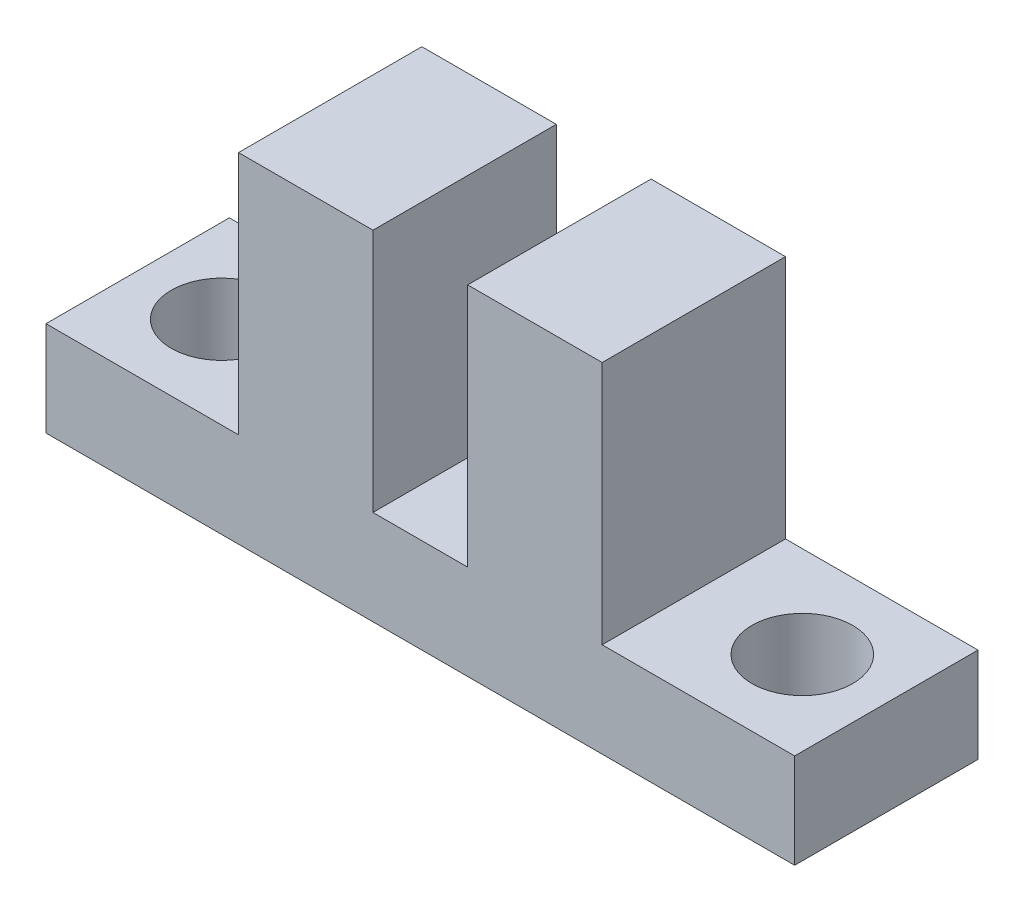
ISO-10303-21;
HEADER;
FILE_DESCRIPTION(('STEP AP214'),'2;1');
FILE_NAME('part.step','',(''),(''),'','','');
FILE_SCHEMA(('AUTOMOTIVE_DESIGN { 1 0 10303 214 1 1 1 1 }'));
ENDSEC;
DATA;
#1=APPLICATION_CONTEXT('core data for automotive mechanical design processes');
#2=APPLICATION_PROTOCOL_DEFINITION('international standard','automotive_design',2000,#1);
#3=PRODUCT_CONTEXT('',#1,'mechanical');
#4=PRODUCT('Part','Part','',(#3));
#5=PRODUCT_RELATED_PRODUCT_CATEGORY('part','',(#4));
#6=PRODUCT_DEFINITION_FORMATION('','',#4);
#7=PRODUCT_DEFINITION_CONTEXT('part definition',#1,'design');
#8=PRODUCT_DEFINITION('design','',#6,#7);
#9=PRODUCT_DEFINITION_SHAPE('','',#8);
#10=(LENGTH_UNIT() NAMED_UNIT(*) SI_UNIT(.MILLI.,.METRE.));
#11=(NAMED_UNIT(*) PLANE_ANGLE_UNIT() SI_UNIT($,.RADIAN.));
#12=(NAMED_UNIT(*) SI_UNIT($,.STERADIAN.) SOLID_ANGLE_UNIT());
#13=UNCERTAINTY_MEASURE_WITH_UNIT(LENGTH_MEASURE(1.E-05),#10,'distance_accuracy_value','');
#14=(GEOMETRIC_REPRESENTATION_CONTEXT(3) GLOBAL_UNCERTAINTY_ASSIGNED_CONTEXT((#13)) GLOBAL_UNIT_ASSIGNED_CONTEXT((#10,
#11,#12)) REPRESENTATION_CONTEXT('',''));
#15=CARTESIAN_POINT('',(0.,0.,0.));
#16=DIRECTION('',(0.,0.,1.));
#17=DIRECTION('',(1.,0.,0.));
#18=AXIS2_PLACEMENT_3D('',#15,#16,#17);
#19=CARTESIAN_POINT('',(0.,3.1,0.));
#20=DIRECTION('',(0.,-1.,0.));
#21=DIRECTION('',(0.,0.,-1.));
#22=AXIS2_PLACEMENT_3D('',#19,#20,#21);
#23=PLANE('',#22);
#24=DIRECTION('',(0.,0.,1.));
#25=VECTOR('',#24,1.);
#26=CARTESIAN_POINT('',(13.8,3.1,-6.));
#27=LINE('',#26,#25);
#28=CARTESIAN_POINT('',(13.8,3.1,-6.));
#29=VERTEX_POINT('',#28);
#30=CARTESIAN_POINT('',(13.8,3.1,0.));
#31=VERTEX_POINT('',#30);
#32=EDGE_CURVE('E145',#29,#31,#27,.T.);
#33=ORIENTED_EDGE('',*,*,#32,.F.);
#34=DIRECTION('',(-1.,0.,0.));
#35=VECTOR('',#34,1.);
#36=CARTESIAN_POINT('',(0.,3.1,-6.));
#37=LINE('',#36,#35);
#38=CARTESIAN_POINT('',(10.7,3.1,-6.));
#39=VERTEX_POINT('',#38);
#40=EDGE_CURVE('E204',#29,#39,#37,.T.);
#41=ORIENTED_EDGE('',*,*,#40,.T.);
#42=DIRECTION('',(0.,0.,-1.));
#43=VECTOR('',#42,1.);
#44=CARTESIAN_POINT('',(10.7,3.1,-6.));
#45=LINE('',#44,#43);
#46=CARTESIAN_POINT('',(10.7,3.1,0.));
#47=VERTEX_POINT('',#46);
#48=EDGE_CURVE('E149',#47,#39,#45,.T.);
#49=ORIENTED_EDGE('',*,*,#48,.F.);
#50=DIRECTION('',(1.,0.,0.));
#51=VECTOR('',#50,1.);
#52=CARTESIAN_POINT('',(0.,3.1,0.));
#53=LINE('',#52,#51);
#54=EDGE_CURVE('E57',#47,#31,#53,.T.);
#55=ORIENTED_EDGE('',*,*,#54,.T.);
#56=EDGE_LOOP('',(#33,#41,#49,#55));
#57=FACE_BOUND('',#56,.T.);
#58=ADVANCED_FACE('F34',(#57),#23,.F.);
#59=CARTESIAN_POINT('',(21.75,3.1,-3.));
#60=DIRECTION('',(0.,1.,0.));
#61=DIRECTION('',(0.,0.,1.));
#62=AXIS2_PLACEMENT_3D('',#59,#60,#61);
#63=CIRCLE('',#62,1.65);
#64=CARTESIAN_POINT('',(21.75,3.1,-4.65));
#65=VERTEX_POINT('',#64);
#66=EDGE_CURVE('E179',#65,#65,#63,.T.);
#67=ORIENTED_EDGE('',*,*,#66,.F.);
#68=EDGE_LOOP('',(#67));
#69=FACE_BOUND('',#68,.T.);
#70=DIRECTION('',(0.,0.,-1.));
#71=VECTOR('',#70,1.);
#72=CARTESIAN_POINT('',(18.2,3.1,-6.));
#73=LINE('',#72,#71);
#74=CARTESIAN_POINT('',(18.2,3.1,0.));
#75=VERTEX_POINT('',#74);
#76=CARTESIAN_POINT('',(18.2,3.1,-6.));
#77=VERTEX_POINT('',#76);
#78=EDGE_CURVE('E49',#75,#77,#73,.T.);
#79=ORIENTED_EDGE('',*,*,#78,.F.);
#80=CARTESIAN_POINT('',(24.5,3.1,0.));
#81=VERTEX_POINT('',#80);
#82=EDGE_CURVE('E194',#75,#81,#53,.T.);
#83=ORIENTED_EDGE('',*,*,#82,.T.);
#84=DIRECTION('',(0.,0.,-1.));
#85=VECTOR('',#84,1.);
#86=CARTESIAN_POINT('',(24.5,3.1,0.));
#87=LINE('',#86,#85);
#88=CARTESIAN_POINT('',(24.5,3.1,-6.));
#89=VERTEX_POINT('',#88);
#90=EDGE_CURVE('E198',#81,#89,#87,.T.);
#91=ORIENTED_EDGE('',*,*,#90,.T.);
#92=EDGE_CURVE('E201',#89,#77,#37,.T.);
#93=ORIENTED_EDGE('',*,*,#92,.T.);
#94=EDGE_LOOP('',(#79,#83,#91,#93));
#95=FACE_BOUND('',#94,.T.);
#96=ADVANCED_FACE('F249',(#69,#95),#23,.F.);
#97=CARTESIAN_POINT('',(2.75,3.1,-3.));
#98=DIRECTION('',(0.,1.,0.));
#99=DIRECTION('',(0.,0.,1.));
#100=AXIS2_PLACEMENT_3D('',#97,#98,#99);
#101=CIRCLE('',#100,1.65);
#102=CARTESIAN_POINT('',(2.75,3.1,-4.65));
#103=VERTEX_POINT('',#102);
#104=EDGE_CURVE('E185',#103,#103,#101,.T.);
#105=ORIENTED_EDGE('',*,*,#104,.F.);
#106=EDGE_LOOP('',(#105));
#107=FACE_BOUND('',#106,.T.);
#108=DIRECTION('',(0.,0.,1.));
#109=VECTOR('',#108,1.);
#110=CARTESIAN_POINT('',(6.3,3.1,-6.));
#111=LINE('',#110,#109);
#112=CARTESIAN_POINT('',(6.3,3.1,-6.));
#113=VERTEX_POINT('',#112);
#114=CARTESIAN_POINT('',(6.3,3.1,0.));
#115=VERTEX_POINT('',#114);
#116=EDGE_CURVE('E146',#113,#115,#111,.T.);
#117=ORIENTED_EDGE('',*,*,#116,.F.);
#118=CARTESIAN_POINT('',(0.,3.1,-6.));
#119=VERTEX_POINT('',#118);
#120=EDGE_CURVE('E200',#113,#119,#37,.T.);
#121=ORIENTED_EDGE('',*,*,#120,.T.);
#122=DIRECTION('',(0.,0.,1.));
#123=VECTOR('',#122,1.);
#124=CARTESIAN_POINT('',(0.,3.1,0.));
#125=LINE('',#124,#123);
#126=CARTESIAN_POINT('',(0.,3.1,0.));
#127=VERTEX_POINT('',#126);
#128=EDGE_CURVE('E191',#119,#127,#125,.T.);
#129=ORIENTED_EDGE('',*,*,#128,.T.);
#130=EDGE_CURVE('E196',#127,#115,#53,.T.);
#131=ORIENTED_EDGE('',*,*,#130,.T.);
#132=EDGE_LOOP('',(#117,#121,#129,#131));
#133=FACE_BOUND('',#132,.T.);
#134=ADVANCED_FACE('F237',(#107,#133),#23,.F.);
#135=CARTESIAN_POINT('',(0.,0.,0.));
#136=DIRECTION('',(0.,-1.,0.));
#137=DIRECTION('',(0.,0.,-1.));
#138=AXIS2_PLACEMENT_3D('',#135,#136,#137);
#139=PLANE('',#138);
#140=CARTESIAN_POINT('',(2.75,0.,-3.));
#141=DIRECTION('',(0.,1.,0.));
#142=DIRECTION('',(0.,0.,1.));
#143=AXIS2_PLACEMENT_3D('',#140,#141,#142);
#144=CIRCLE('',#143,1.65);
#145=CARTESIAN_POINT('',(2.75,0.,-4.65));
#146=VERTEX_POINT('',#145);
#147=EDGE_CURVE('E182',#146,#146,#144,.T.);
#148=ORIENTED_EDGE('',*,*,#147,.T.);
#149=EDGE_LOOP('',(#148));
#150=FACE_BOUND('',#149,.T.);
#151=DIRECTION('',(0.,0.,1.));
#152=VECTOR('',#151,1.);
#153=CARTESIAN_POINT('',(0.,0.,0.));
#154=LINE('',#153,#152);
#155=CARTESIAN_POINT('',(0.,0.,-6.));
#156=VERTEX_POINT('',#155);
#157=CARTESIAN_POINT('',(0.,0.,0.));
#158=VERTEX_POINT('',#157);
#159=EDGE_CURVE('E188',#156,#158,#154,.T.);
#160=ORIENTED_EDGE('',*,*,#159,.F.);
#161=DIRECTION('',(-1.,0.,0.));
#162=VECTOR('',#161,1.);
#163=CARTESIAN_POINT('',(0.,0.,-6.));
#164=LINE('',#163,#162);
#165=CARTESIAN_POINT('',(24.5,0.,-6.));
#166=VERTEX_POINT('',#165);
#167=EDGE_CURVE('E195',#166,#156,#164,.T.);
#168=ORIENTED_EDGE('',*,*,#167,.F.);
#169=DIRECTION('',(0.,0.,-1.));
#170=VECTOR('',#169,1.);
#171=CARTESIAN_POINT('',(24.5,0.,0.));
#172=LINE('',#171,#170);
#173=CARTESIAN_POINT('',(24.5,0.,0.));
#174=VERTEX_POINT('',#173);
#175=EDGE_CURVE('E209',#174,#166,#172,.T.);
#176=ORIENTED_EDGE('',*,*,#175,.F.);
#177=DIRECTION('',(1.,0.,0.));
#178=VECTOR('',#177,1.);
#179=CARTESIAN_POINT('',(0.,0.,0.));
#180=LINE('',#179,#178);
#181=EDGE_CURVE('E207',#158,#174,#180,.T.);
#182=ORIENTED_EDGE('',*,*,#181,.F.);
#183=EDGE_LOOP('',(#160,#168,#176,#182));
#184=FACE_BOUND('',#183,.T.);
#185=CARTESIAN_POINT('',(21.75,0.,-3.));
#186=DIRECTION('',(0.,1.,0.));
#187=DIRECTION('',(0.,0.,1.));
#188=AXIS2_PLACEMENT_3D('',#185,#186,#187);
#189=CIRCLE('',#188,1.65);
#190=CARTESIAN_POINT('',(21.75,0.,-4.65));
#191=VERTEX_POINT('',#190);
#192=EDGE_CURVE('E178',#191,#191,#189,.T.);
#193=ORIENTED_EDGE('',*,*,#192,.T.);
#194=EDGE_LOOP('',(#193));
#195=FACE_BOUND('',#194,.T.);
#196=ADVANCED_FACE('F226',(#150,#184,#195),#139,.T.);
#197=CARTESIAN_POINT('',(0.,3.1,0.));
#198=DIRECTION('',(1.,0.,0.));
#199=DIRECTION('',(0.,0.,-1.));
#200=AXIS2_PLACEMENT_3D('',#197,#198,#199);
#201=PLANE('',#200);
#202=ORIENTED_EDGE('',*,*,#159,.T.);
#203=DIRECTION('',(0.,-1.,0.));
#204=VECTOR('',#203,1.);
#205=CARTESIAN_POINT('',(0.,3.1,0.));
#206=LINE('',#205,#204);
#207=EDGE_CURVE('E11',#127,#158,#206,.T.);
#208=ORIENTED_EDGE('',*,*,#207,.F.);
#209=ORIENTED_EDGE('',*,*,#128,.F.);
#210=DIRECTION('',(0.,-1.,0.));
#211=VECTOR('',#210,1.);
#212=CARTESIAN_POINT('',(0.,3.1,-6.));
#213=LINE('',#212,#211);
#214=EDGE_CURVE('E203',#119,#156,#213,.T.);
#215=ORIENTED_EDGE('',*,*,#214,.T.);
#216=EDGE_LOOP('',(#202,#208,#209,#215));
#217=FACE_BOUND('',#216,.T.);
#218=ADVANCED_FACE('F36',(#217),#201,.F.);
#219=CARTESIAN_POINT('',(0.,3.1,0.));
#220=DIRECTION('',(0.,0.,-1.));
#221=DIRECTION('',(-1.,0.,0.));
#222=AXIS2_PLACEMENT_3D('',#219,#220,#221);
#223=PLANE('',#222);
#224=ORIENTED_EDGE('',*,*,#181,.T.);
#225=DIRECTION('',(0.,-1.,0.));
#226=VECTOR('',#225,1.);
#227=CARTESIAN_POINT('',(24.5,3.1,0.));
#228=LINE('',#227,#226);
#229=EDGE_CURVE('E42',#81,#174,#228,.T.);
#230=ORIENTED_EDGE('',*,*,#229,.F.);
#231=ORIENTED_EDGE('',*,*,#82,.F.);
#232=DIRECTION('',(0.,-1.,0.));
#233=VECTOR('',#232,1.);
#234=CARTESIAN_POINT('',(18.2,11.1,0.));
#235=LINE('',#234,#233);
#236=CARTESIAN_POINT('',(18.2,11.1,0.));
#237=VERTEX_POINT('',#236);
#238=EDGE_CURVE('E130',#237,#75,#235,.T.);
#239=ORIENTED_EDGE('',*,*,#238,.F.);
#240=DIRECTION('',(1.,0.,0.));
#241=VECTOR('',#240,1.);
#242=CARTESIAN_POINT('',(13.8,11.1,0.));
#243=LINE('',#242,#241);
#244=CARTESIAN_POINT('',(13.8,11.1,0.));
#245=VERTEX_POINT('',#244);
#246=EDGE_CURVE('E123',#245,#237,#243,.T.);
#247=ORIENTED_EDGE('',*,*,#246,.F.);
#248=DIRECTION('',(0.,-1.,0.));
#249=VECTOR('',#248,1.);
#250=CARTESIAN_POINT('',(13.8,11.1,0.));
#251=LINE('',#250,#249);
#252=EDGE_CURVE('E127',#245,#31,#251,.T.);
#253=ORIENTED_EDGE('',*,*,#252,.T.);
#254=ORIENTED_EDGE('',*,*,#54,.F.);
#255=DIRECTION('',(0.,-1.,0.));
#256=VECTOR('',#255,1.);
#257=CARTESIAN_POINT('',(10.7,11.1,0.));
#258=LINE('',#257,#256);
#259=CARTESIAN_POINT('',(10.7,11.1,0.));
#260=VERTEX_POINT('',#259);
#261=EDGE_CURVE('E172',#260,#47,#258,.T.);
#262=ORIENTED_EDGE('',*,*,#261,.F.);
#263=DIRECTION('',(1.,0.,0.));
#264=VECTOR('',#263,1.);
#265=CARTESIAN_POINT('',(6.3,11.1,0.));
#266=LINE('',#265,#264);
#267=CARTESIAN_POINT('',(6.3,11.1,0.));
#268=VERTEX_POINT('',#267);
#269=EDGE_CURVE('E158',#268,#260,#266,.T.);
#270=ORIENTED_EDGE('',*,*,#269,.F.);
#271=DIRECTION('',(0.,-1.,0.));
#272=VECTOR('',#271,1.);
#273=CARTESIAN_POINT('',(6.3,11.1,0.));
#274=LINE('',#273,#272);
#275=EDGE_CURVE('E175',#268,#115,#274,.T.);
#276=ORIENTED_EDGE('',*,*,#275,.T.);
#277=ORIENTED_EDGE('',*,*,#130,.F.);
#278=ORIENTED_EDGE('',*,*,#207,.T.);
#279=EDGE_LOOP('',(#224,#230,#231,#239,#247,#253,#254,#262,#270,#276,#277,#278));
#280=FACE_BOUND('',#279,.T.);
#281=ADVANCED_FACE('F125',(#280),#223,.F.);
#282=CARTESIAN_POINT('',(24.5,3.1,0.));
#283=DIRECTION('',(-1.,0.,0.));
#284=DIRECTION('',(0.,0.,1.));
#285=AXIS2_PLACEMENT_3D('',#282,#283,#284);
#286=PLANE('',#285);
#287=ORIENTED_EDGE('',*,*,#175,.T.);
#288=DIRECTION('',(0.,-1.,0.));
#289=VECTOR('',#288,1.);
#290=CARTESIAN_POINT('',(24.5,3.1,-6.));
#291=LINE('',#290,#289);
#292=EDGE_CURVE('E214',#89,#166,#291,.T.);
#293=ORIENTED_EDGE('',*,*,#292,.F.);
#294=ORIENTED_EDGE('',*,*,#90,.F.);
#295=ORIENTED_EDGE('',*,*,#229,.T.);
#296=EDGE_LOOP('',(#287,#293,#294,#295));
#297=FACE_BOUND('',#296,.T.);
#298=ADVANCED_FACE('F221',(#297),#286,.F.);
#299=CARTESIAN_POINT('',(0.,3.1,-6.));
#300=DIRECTION('',(0.,0.,1.));
#301=DIRECTION('',(1.,0.,0.));
#302=AXIS2_PLACEMENT_3D('',#299,#300,#301);
#303=PLANE('',#302);
#304=ORIENTED_EDGE('',*,*,#167,.T.);
#305=ORIENTED_EDGE('',*,*,#214,.F.);
#306=ORIENTED_EDGE('',*,*,#120,.F.);
#307=DIRECTION('',(0.,-1.,0.));
#308=VECTOR('',#307,1.);
#309=CARTESIAN_POINT('',(6.3,11.1,-6.));
#310=LINE('',#309,#308);
#311=CARTESIAN_POINT('',(6.3,11.1,-6.));
#312=VERTEX_POINT('',#311);
#313=EDGE_CURVE('E163',#312,#113,#310,.T.);
#314=ORIENTED_EDGE('',*,*,#313,.F.);
#315=DIRECTION('',(-1.,0.,0.));
#316=VECTOR('',#315,1.);
#317=CARTESIAN_POINT('',(6.3,11.1,-6.));
#318=LINE('',#317,#316);
#319=CARTESIAN_POINT('',(10.7,11.1,-6.));
#320=VERTEX_POINT('',#319);
#321=EDGE_CURVE('E162',#320,#312,#318,.T.);
#322=ORIENTED_EDGE('',*,*,#321,.F.);
#323=DIRECTION('',(0.,-1.,0.));
#324=VECTOR('',#323,1.);
#325=CARTESIAN_POINT('',(10.7,11.1,-6.));
#326=LINE('',#325,#324);
#327=EDGE_CURVE('E169',#320,#39,#326,.T.);
#328=ORIENTED_EDGE('',*,*,#327,.T.);
#329=ORIENTED_EDGE('',*,*,#40,.F.);
#330=DIRECTION('',(0.,-1.,0.));
#331=VECTOR('',#330,1.);
#332=CARTESIAN_POINT('',(13.8,11.1,-6.));
#333=LINE('',#332,#331);
#334=CARTESIAN_POINT('',(13.8,11.1,-6.));
#335=VERTEX_POINT('',#334);
#336=EDGE_CURVE('E255',#335,#29,#333,.T.);
#337=ORIENTED_EDGE('',*,*,#336,.F.);
#338=DIRECTION('',(-1.,0.,0.));
#339=VECTOR('',#338,1.);
#340=CARTESIAN_POINT('',(13.8,11.1,-6.));
#341=LINE('',#340,#339);
#342=CARTESIAN_POINT('',(18.2,11.1,-6.));
#343=VERTEX_POINT('',#342);
#344=EDGE_CURVE('E139',#343,#335,#341,.T.);
#345=ORIENTED_EDGE('',*,*,#344,.F.);
#346=DIRECTION('',(0.,-1.,0.));
#347=VECTOR('',#346,1.);
#348=CARTESIAN_POINT('',(18.2,11.1,-6.));
#349=LINE('',#348,#347);
#350=EDGE_CURVE('E151',#343,#77,#349,.T.);
#351=ORIENTED_EDGE('',*,*,#350,.T.);
#352=ORIENTED_EDGE('',*,*,#92,.F.);
#353=ORIENTED_EDGE('',*,*,#292,.T.);
#354=EDGE_LOOP('',(#304,#305,#306,#314,#322,#328,#329,#337,#345,#351,#352,#353));
#355=FACE_BOUND('',#354,.T.);
#356=ADVANCED_FACE('F230',(#355),#303,.F.);
#357=CARTESIAN_POINT('',(2.75,3.1,-3.));
#358=DIRECTION('',(0.,-1.,0.));
#359=DIRECTION('',(0.,0.,-1.));
#360=AXIS2_PLACEMENT_3D('',#357,#358,#359);
#361=CYLINDRICAL_SURFACE('',#360,1.65);
#362=CARTESIAN_POINT('',(2.75,3.1,-4.65));
#363=CARTESIAN_POINT('',(2.75,3.06770833333333,-4.65));
#364=CARTESIAN_POINT('',(2.75,3.03541666666667,-4.65));
#365=CARTESIAN_POINT('',(2.75,2.97083333333333,-4.65));
#366=CARTESIAN_POINT('',(2.75,2.93854166666667,-4.65));
#367=CARTESIAN_POINT('',(2.75,2.87395833333333,-4.65));
#368=CARTESIAN_POINT('',(2.75,2.84166666666667,-4.65));
#369=CARTESIAN_POINT('',(2.75,2.77708333333333,-4.65));
#370=CARTESIAN_POINT('',(2.75,2.74479166666667,-4.65));
#371=CARTESIAN_POINT('',(2.75,2.68020833333333,-4.65));
#372=CARTESIAN_POINT('',(2.75,2.64791666666667,-4.65));
#373=CARTESIAN_POINT('',(2.75,2.58333333333333,-4.65));
#374=CARTESIAN_POINT('',(2.75,2.55104166666667,-4.65));
#375=CARTESIAN_POINT('',(2.75,2.48645833333333,-4.65));
#376=CARTESIAN_POINT('',(2.75,2.45416666666667,-4.65));
#377=CARTESIAN_POINT('',(2.75,2.38958333333333,-4.65));
#378=CARTESIAN_POINT('',(2.75,2.35729166666667,-4.65));
#379=CARTESIAN_POINT('',(2.75,2.29270833333333,-4.65));
#380=CARTESIAN_POINT('',(2.75,2.26041666666667,-4.65));
#381=CARTESIAN_POINT('',(2.75,2.19583333333333,-4.65));
#382=CARTESIAN_POINT('',(2.75,2.16354166666667,-4.65));
#383=CARTESIAN_POINT('',(2.75,2.09895833333333,-4.65));
#384=CARTESIAN_POINT('',(2.75,2.06666666666667,-4.65));
#385=CARTESIAN_POINT('',(2.75,2.00208333333333,-4.65));
#386=CARTESIAN_POINT('',(2.75,1.96979166666667,-4.65));
#387=CARTESIAN_POINT('',(2.75,1.90520833333333,-4.65));
#388=CARTESIAN_POINT('',(2.75,1.87291666666667,-4.65));
#389=CARTESIAN_POINT('',(2.75,1.80833333333333,-4.65));
#390=CARTESIAN_POINT('',(2.75,1.77604166666667,-4.65));
#391=CARTESIAN_POINT('',(2.75,1.71145833333333,-4.65));
#392=CARTESIAN_POINT('',(2.75,1.67916666666667,-4.65));
#393=CARTESIAN_POINT('',(2.75,1.61458333333333,-4.65));
#394=CARTESIAN_POINT('',(2.75,1.58229166666667,-4.65));
#395=CARTESIAN_POINT('',(2.75,1.51770833333333,-4.65));
#396=CARTESIAN_POINT('',(2.75,1.48541666666667,-4.65));
#397=CARTESIAN_POINT('',(2.75,1.42083333333333,-4.65));
#398=CARTESIAN_POINT('',(2.75,1.38854166666667,-4.65));
#399=CARTESIAN_POINT('',(2.75,1.32395833333333,-4.65));
#400=CARTESIAN_POINT('',(2.75,1.29166666666667,-4.65));
#401=CARTESIAN_POINT('',(2.75,1.22708333333333,-4.65));
#402=CARTESIAN_POINT('',(2.75,1.19479166666667,-4.65));
#403=CARTESIAN_POINT('',(2.75,1.13020833333333,-4.65));
#404=CARTESIAN_POINT('',(2.75,1.09791666666667,-4.65));
#405=CARTESIAN_POINT('',(2.75,1.03333333333333,-4.65));
#406=CARTESIAN_POINT('',(2.75,1.00104166666667,-4.65));
#407=CARTESIAN_POINT('',(2.75,0.936458333333333,-4.65));
#408=CARTESIAN_POINT('',(2.75,0.904166666666667,-4.65));
#409=CARTESIAN_POINT('',(2.75,0.839583333333334,-4.65));
#410=CARTESIAN_POINT('',(2.75,0.807291666666667,-4.65));
#411=CARTESIAN_POINT('',(2.75,0.742708333333333,-4.65));
#412=CARTESIAN_POINT('',(2.75,0.710416666666667,-4.65));
#413=CARTESIAN_POINT('',(2.75,0.645833333333333,-4.65));
#414=CARTESIAN_POINT('',(2.75,0.613541666666667,-4.65));
#415=CARTESIAN_POINT('',(2.75,0.548958333333333,-4.65));
#416=CARTESIAN_POINT('',(2.75,0.516666666666667,-4.65));
#417=CARTESIAN_POINT('',(2.75,0.452083333333333,-4.65));
#418=CARTESIAN_POINT('',(2.75,0.419791666666667,-4.65));
#419=CARTESIAN_POINT('',(2.75,0.355208333333333,-4.65));
#420=CARTESIAN_POINT('',(2.75,0.322916666666667,-4.65));
#421=CARTESIAN_POINT('',(2.75,0.258333333333333,-4.65));
#422=CARTESIAN_POINT('',(2.75,0.226041666666667,-4.65));
#423=CARTESIAN_POINT('',(2.75,0.161458333333333,-4.65));
#424=CARTESIAN_POINT('',(2.75,0.129166666666667,-4.65));
#425=CARTESIAN_POINT('',(2.75,0.0645833333333335,-4.65));
#426=CARTESIAN_POINT('',(2.75,0.0322916666666667,-4.65));
#427=CARTESIAN_POINT('',(2.75,0.,-4.65));
#428=B_SPLINE_CURVE_WITH_KNOTS('',3,(#362,#363,#364,#365,#366,#367,#368,#369,#370,#371,#372,
#373,#374,#375,#376,#377,#378,#379,#380,#381,#382,#383,#384,#385,#386,#387,#388,#389,#390,#391,
#392,#393,#394,#395,#396,#397,#398,#399,#400,#401,#402,#403,#404,#405,#406,#407,#408,#409,#410,
#411,#412,#413,#414,#415,#416,#417,#418,#419,#420,#421,#422,#423,#424,#425,#426,#427),
.UNSPECIFIED.,.F.,.F.,(4,2,2,2,2,2,2,2,2,2,2,2,2,2,2,2,2,2,2,2,2,2,2,2,2,2,2,2,2,2,2,2,4),(0.,
0.0968750000000002,0.19375,0.290625,0.3875,0.484375,0.58125,0.678125,0.775,0.871875,0.96875,
1.065625,1.1625,1.259375,1.35625,1.453125,1.55,1.646875,1.74375,1.840625,1.9375,2.034375,
2.13125,2.228125,2.325,2.421875,2.51875,2.615625,2.7125,2.809375,2.90625,3.003125,3.1),.UNSPECIFIED.);
#429=EDGE_CURVE('BSEAM284',#103,#146,#428,.T.);
#430=ORIENTED_EDGE('',*,*,#104,.T.);
#431=ORIENTED_EDGE('',*,*,#147,.F.);
#432=ORIENTED_EDGE('',*,*,#429,.T.);
#433=ORIENTED_EDGE('',*,*,#429,.F.);
#434=EDGE_LOOP('',(#430,#432,#431,#433));
#435=FACE_BOUND('',#434,.T.);
#436=ADVANCED_FACE('F284',(#435),#361,.F.);
#437=CARTESIAN_POINT('',(21.75,3.1,-3.));
#438=DIRECTION('',(0.,-1.,0.));
#439=DIRECTION('',(0.,0.,-1.));
#440=AXIS2_PLACEMENT_3D('',#437,#438,#439);
#441=CYLINDRICAL_SURFACE('',#440,1.65);
#442=CARTESIAN_POINT('',(21.75,3.1,-4.65));
#443=CARTESIAN_POINT('',(21.75,3.06770833333333,-4.65));
#444=CARTESIAN_POINT('',(21.75,3.03541666666667,-4.65));
#445=CARTESIAN_POINT('',(21.75,2.97083333333333,-4.65));
#446=CARTESIAN_POINT('',(21.75,2.93854166666667,-4.65));
#447=CARTESIAN_POINT('',(21.75,2.87395833333333,-4.65));
#448=CARTESIAN_POINT('',(21.75,2.84166666666667,-4.65));
#449=CARTESIAN_POINT('',(21.75,2.77708333333333,-4.65));
#450=CARTESIAN_POINT('',(21.75,2.74479166666667,-4.65));
#451=CARTESIAN_POINT('',(21.75,2.68020833333333,-4.65));
#452=CARTESIAN_POINT('',(21.75,2.64791666666667,-4.65));
#453=CARTESIAN_POINT('',(21.75,2.58333333333333,-4.65));
#454=CARTESIAN_POINT('',(21.75,2.55104166666667,-4.65));
#455=CARTESIAN_POINT('',(21.75,2.48645833333333,-4.65));
#456=CARTESIAN_POINT('',(21.75,2.45416666666667,-4.65));
#457=CARTESIAN_POINT('',(21.75,2.38958333333333,-4.65));
#458=CARTESIAN_POINT('',(21.75,2.35729166666667,-4.65));
#459=CARTESIAN_POINT('',(21.75,2.29270833333333,-4.65));
#460=CARTESIAN_POINT('',(21.75,2.26041666666667,-4.65));
#461=CARTESIAN_POINT('',(21.75,2.19583333333333,-4.65));
#462=CARTESIAN_POINT('',(21.75,2.16354166666667,-4.65));
#463=CARTESIAN_POINT('',(21.75,2.09895833333333,-4.65));
#464=CARTESIAN_POINT('',(21.75,2.06666666666667,-4.65));
#465=CARTESIAN_POINT('',(21.75,2.00208333333333,-4.65));
#466=CARTESIAN_POINT('',(21.75,1.96979166666667,-4.65));
#467=CARTESIAN_POINT('',(21.75,1.90520833333333,-4.65));
#468=CARTESIAN_POINT('',(21.75,1.87291666666667,-4.65));
#469=CARTESIAN_POINT('',(21.75,1.80833333333333,-4.65));
#470=CARTESIAN_POINT('',(21.75,1.77604166666667,-4.65));
#471=CARTESIAN_POINT('',(21.75,1.71145833333333,-4.65));
#472=CARTESIAN_POINT('',(21.75,1.67916666666667,-4.65));
#473=CARTESIAN_POINT('',(21.75,1.61458333333333,-4.65));
#474=CARTESIAN_POINT('',(21.75,1.58229166666667,-4.65));
#475=CARTESIAN_POINT('',(21.75,1.51770833333333,-4.65));
#476=CARTESIAN_POINT('',(21.75,1.48541666666667,-4.65));
#477=CARTESIAN_POINT('',(21.75,1.42083333333333,-4.65));
#478=CARTESIAN_POINT('',(21.75,1.38854166666667,-4.65));
#479=CARTESIAN_POINT('',(21.75,1.32395833333333,-4.65));
#480=CARTESIAN_POINT('',(21.75,1.29166666666667,-4.65));
#481=CARTESIAN_POINT('',(21.75,1.22708333333333,-4.65));
#482=CARTESIAN_POINT('',(21.75,1.19479166666667,-4.65));
#483=CARTESIAN_POINT('',(21.75,1.13020833333333,-4.65));
#484=CARTESIAN_POINT('',(21.75,1.09791666666667,-4.65));
#485=CARTESIAN_POINT('',(21.75,1.03333333333333,-4.65));
#486=CARTESIAN_POINT('',(21.75,1.00104166666667,-4.65));
#487=CARTESIAN_POINT('',(21.75,0.936458333333333,-4.65));
#488=CARTESIAN_POINT('',(21.75,0.904166666666667,-4.65));
#489=CARTESIAN_POINT('',(21.75,0.839583333333334,-4.65));
#490=CARTESIAN_POINT('',(21.75,0.807291666666667,-4.65));
#491=CARTESIAN_POINT('',(21.75,0.742708333333333,-4.65));
#492=CARTESIAN_POINT('',(21.75,0.710416666666667,-4.65));
#493=CARTESIAN_POINT('',(21.75,0.645833333333333,-4.65));
#494=CARTESIAN_POINT('',(21.75,0.613541666666667,-4.65));
#495=CARTESIAN_POINT('',(21.75,0.548958333333333,-4.65));
#496=CARTESIAN_POINT('',(21.75,0.516666666666667,-4.65));
#497=CARTESIAN_POINT('',(21.75,0.452083333333333,-4.65));
#498=CARTESIAN_POINT('',(21.75,0.419791666666667,-4.65));
#499=CARTESIAN_POINT('',(21.75,0.355208333333333,-4.65));
#500=CARTESIAN_POINT('',(21.75,0.322916666666667,-4.65));
#501=CARTESIAN_POINT('',(21.75,0.258333333333333,-4.65));
#502=CARTESIAN_POINT('',(21.75,0.226041666666667,-4.65));
#503=CARTESIAN_POINT('',(21.75,0.161458333333333,-4.65));
#504=CARTESIAN_POINT('',(21.75,0.129166666666667,-4.65));
#505=CARTESIAN_POINT('',(21.75,0.0645833333333335,-4.65));
#506=CARTESIAN_POINT('',(21.75,0.0322916666666667,-4.65));
#507=CARTESIAN_POINT('',(21.75,0.,-4.65));
#508=B_SPLINE_CURVE_WITH_KNOTS('',3,(#442,#443,#444,#445,#446,#447,#448,#449,#450,#451,#452,
#453,#454,#455,#456,#457,#458,#459,#460,#461,#462,#463,#464,#465,#466,#467,#468,#469,#470,#471,
#472,#473,#474,#475,#476,#477,#478,#479,#480,#481,#482,#483,#484,#485,#486,#487,#488,#489,#490,
#491,#492,#493,#494,#495,#496,#497,#498,#499,#500,#501,#502,#503,#504,#505,#506,#507),
.UNSPECIFIED.,.F.,.F.,(4,2,2,2,2,2,2,2,2,2,2,2,2,2,2,2,2,2,2,2,2,2,2,2,2,2,2,2,2,2,2,2,4),(0.,
0.0968750000000002,0.19375,0.290625,0.3875,0.484375,0.58125,0.678125,0.775,0.871875,0.96875,
1.065625,1.1625,1.259375,1.35625,1.453125,1.55,1.646875,1.74375,1.840625,1.9375,2.034375,
2.13125,2.228125,2.325,2.421875,2.51875,2.615625,2.7125,2.809375,2.90625,3.003125,3.1),.UNSPECIFIED.);
#509=EDGE_CURVE('BSEAM287',#65,#191,#508,.T.);
#510=ORIENTED_EDGE('',*,*,#66,.T.);
#511=ORIENTED_EDGE('',*,*,#192,.F.);
#512=ORIENTED_EDGE('',*,*,#509,.T.);
#513=ORIENTED_EDGE('',*,*,#509,.F.);
#514=EDGE_LOOP('',(#510,#512,#511,#513));
#515=FACE_BOUND('',#514,.T.);
#516=ADVANCED_FACE('F287',(#515),#441,.F.);
#517=CARTESIAN_POINT('',(6.3,11.1,-6.));
#518=DIRECTION('',(1.,0.,0.));
#519=DIRECTION('',(0.,0.,-1.));
#520=AXIS2_PLACEMENT_3D('',#517,#518,#519);
#521=PLANE('',#520);
#522=ORIENTED_EDGE('',*,*,#116,.T.);
#523=ORIENTED_EDGE('',*,*,#275,.F.);
#524=DIRECTION('',(0.,0.,1.));
#525=VECTOR('',#524,1.);
#526=CARTESIAN_POINT('',(6.3,11.1,-6.));
#527=LINE('',#526,#525);
#528=EDGE_CURVE('E155',#312,#268,#527,.T.);
#529=ORIENTED_EDGE('',*,*,#528,.F.);
#530=ORIENTED_EDGE('',*,*,#313,.T.);
#531=EDGE_LOOP('',(#522,#523,#529,#530));
#532=FACE_BOUND('',#531,.T.);
#533=ADVANCED_FACE('F293',(#532),#521,.F.);
#534=CARTESIAN_POINT('',(10.7,11.1,-6.));
#535=DIRECTION('',(-1.,0.,0.));
#536=DIRECTION('',(0.,0.,1.));
#537=AXIS2_PLACEMENT_3D('',#534,#535,#536);
#538=PLANE('',#537);
#539=ORIENTED_EDGE('',*,*,#48,.T.);
#540=ORIENTED_EDGE('',*,*,#327,.F.);
#541=DIRECTION('',(0.,0.,-1.));
#542=VECTOR('',#541,1.);
#543=CARTESIAN_POINT('',(10.7,11.1,-6.));
#544=LINE('',#543,#542);
#545=EDGE_CURVE('E160',#260,#320,#544,.T.);
#546=ORIENTED_EDGE('',*,*,#545,.F.);
#547=ORIENTED_EDGE('',*,*,#261,.T.);
#548=EDGE_LOOP('',(#539,#540,#546,#547));
#549=FACE_BOUND('',#548,.T.);
#550=ADVANCED_FACE('F241',(#549),#538,.F.);
#551=CARTESIAN_POINT('',(0.,11.1,0.));
#552=DIRECTION('',(0.,1.,0.));
#553=DIRECTION('',(0.,0.,1.));
#554=AXIS2_PLACEMENT_3D('',#551,#552,#553);
#555=PLANE('',#554);
#556=ORIENTED_EDGE('',*,*,#528,.T.);
#557=ORIENTED_EDGE('',*,*,#269,.T.);
#558=ORIENTED_EDGE('',*,*,#545,.T.);
#559=ORIENTED_EDGE('',*,*,#321,.T.);
#560=EDGE_LOOP('',(#556,#557,#558,#559));
#561=FACE_BOUND('',#560,.T.);
#562=ADVANCED_FACE('F247',(#561),#555,.T.);
#563=CARTESIAN_POINT('',(13.8,11.1,-6.));
#564=DIRECTION('',(1.,0.,0.));
#565=DIRECTION('',(0.,0.,-1.));
#566=AXIS2_PLACEMENT_3D('',#563,#564,#565);
#567=PLANE('',#566);
#568=ORIENTED_EDGE('',*,*,#32,.T.);
#569=ORIENTED_EDGE('',*,*,#252,.F.);
#570=DIRECTION('',(0.,0.,1.));
#571=VECTOR('',#570,1.);
#572=CARTESIAN_POINT('',(13.8,11.1,-6.));
#573=LINE('',#572,#571);
#574=EDGE_CURVE('E134',#335,#245,#573,.T.);
#575=ORIENTED_EDGE('',*,*,#574,.F.);
#576=ORIENTED_EDGE('',*,*,#336,.T.);
#577=EDGE_LOOP('',(#568,#569,#575,#576));
#578=FACE_BOUND('',#577,.T.);
#579=ADVANCED_FACE('F144',(#578),#567,.F.);
#580=CARTESIAN_POINT('',(18.2,11.1,-6.));
#581=DIRECTION('',(-1.,0.,0.));
#582=DIRECTION('',(0.,0.,1.));
#583=AXIS2_PLACEMENT_3D('',#580,#581,#582);
#584=PLANE('',#583);
#585=ORIENTED_EDGE('',*,*,#78,.T.);
#586=ORIENTED_EDGE('',*,*,#350,.F.);
#587=DIRECTION('',(0.,0.,-1.));
#588=VECTOR('',#587,1.);
#589=CARTESIAN_POINT('',(18.2,11.1,-6.));
#590=LINE('',#589,#588);
#591=EDGE_CURVE('E133',#237,#343,#590,.T.);
#592=ORIENTED_EDGE('',*,*,#591,.F.);
#593=ORIENTED_EDGE('',*,*,#238,.T.);
#594=EDGE_LOOP('',(#585,#586,#592,#593));
#595=FACE_BOUND('',#594,.T.);
#596=ADVANCED_FACE('F251',(#595),#584,.F.);
#597=CARTESIAN_POINT('',(0.,11.1,0.));
#598=DIRECTION('',(0.,1.,0.));
#599=DIRECTION('',(0.,0.,1.));
#600=AXIS2_PLACEMENT_3D('',#597,#598,#599);
#601=PLANE('',#600);
#602=ORIENTED_EDGE('',*,*,#574,.T.);
#603=ORIENTED_EDGE('',*,*,#246,.T.);
#604=ORIENTED_EDGE('',*,*,#591,.T.);
#605=ORIENTED_EDGE('',*,*,#344,.T.);
#606=EDGE_LOOP('',(#602,#603,#604,#605));
#607=FACE_BOUND('',#606,.T.);
#608=ADVANCED_FACE('F137',(#607),#601,.T.);
#609=CLOSED_SHELL('',(#58,#96,#134,#196,#218,#281,#298,#356,#436,#516,#533,#550,#562,#579,#596,#608));
#610=MANIFOLD_SOLID_BREP('B2',#609);
#611=ADVANCED_BREP_SHAPE_REPRESENTATION('',(#18,#610),#14);
#612=SHAPE_DEFINITION_REPRESENTATION(#9,#611);
ENDSEC;
END-ISO-10303-21;
